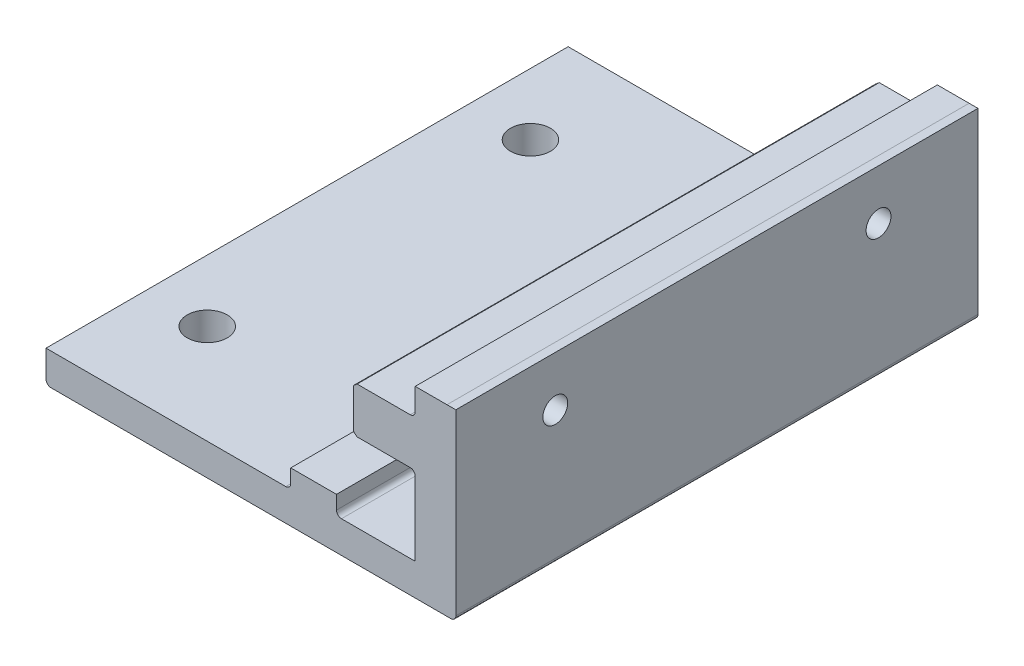
ISO-10303-21;
HEADER;
FILE_DESCRIPTION(('STEP AP214'),'2;1');
FILE_NAME('part.step','',(''),(''),'','','');
FILE_SCHEMA(('AUTOMOTIVE_DESIGN { 1 0 10303 214 1 1 1 1 }'));
ENDSEC;
DATA;
#1=APPLICATION_CONTEXT('core data for automotive mechanical design processes');
#2=APPLICATION_PROTOCOL_DEFINITION('international standard','automotive_design',2000,#1);
#3=PRODUCT_CONTEXT('',#1,'mechanical');
#4=PRODUCT('Part','Part','',(#3));
#5=PRODUCT_RELATED_PRODUCT_CATEGORY('part','',(#4));
#6=PRODUCT_DEFINITION_FORMATION('','',#4);
#7=PRODUCT_DEFINITION_CONTEXT('part definition',#1,'design');
#8=PRODUCT_DEFINITION('design','',#6,#7);
#9=PRODUCT_DEFINITION_SHAPE('','',#8);
#10=(LENGTH_UNIT() NAMED_UNIT(*) SI_UNIT(.MILLI.,.METRE.));
#11=(NAMED_UNIT(*) PLANE_ANGLE_UNIT() SI_UNIT($,.RADIAN.));
#12=(NAMED_UNIT(*) SI_UNIT($,.STERADIAN.) SOLID_ANGLE_UNIT());
#13=UNCERTAINTY_MEASURE_WITH_UNIT(LENGTH_MEASURE(1.E-05),#10,'distance_accuracy_value','');
#14=(GEOMETRIC_REPRESENTATION_CONTEXT(3) GLOBAL_UNCERTAINTY_ASSIGNED_CONTEXT((#13)) GLOBAL_UNIT_ASSIGNED_CONTEXT((#10,
#11,#12)) REPRESENTATION_CONTEXT('',''));
#15=CARTESIAN_POINT('',(0.,0.,0.));
#16=DIRECTION('',(0.,0.,1.));
#17=DIRECTION('',(1.,0.,0.));
#18=AXIS2_PLACEMENT_3D('',#15,#16,#17);
#19=CARTESIAN_POINT('',(17.7288391379452,22.9352063032006,-3749.675));
#20=DIRECTION('',(0.,-1.,0.));
#21=DIRECTION('',(0.,0.,-1.));
#22=AXIS2_PLACEMENT_3D('',#19,#20,#21);
#23=PLANE('',#22);
#24=DIRECTION('',(1.,0.,0.));
#25=VECTOR('',#24,1.);
#26=CARTESIAN_POINT('',(17.7288391379452,22.9352063032006,-3683.));
#27=LINE('',#26,#25);
#28=CARTESIAN_POINT('',(17.7288391379452,22.9352063032006,-3683.));
#29=VERTEX_POINT('',#28);
#30=CARTESIAN_POINT('',(21.7872141992322,22.9352063032006,-3683.));
#31=VERTEX_POINT('',#30);
#32=EDGE_CURVE('E274',#29,#31,#27,.T.);
#33=ORIENTED_EDGE('',*,*,#32,.T.);
#34=DIRECTION('',(0.,0.,1.));
#35=VECTOR('',#34,1.);
#36=CARTESIAN_POINT('',(21.7872141992322,22.9352063032006,-3749.675));
#37=LINE('',#36,#35);
#38=CARTESIAN_POINT('',(21.7872141992322,22.9352063032006,-3749.675));
#39=VERTEX_POINT('',#38);
#40=EDGE_CURVE('E362',#39,#31,#37,.T.);
#41=ORIENTED_EDGE('',*,*,#40,.F.);
#42=DIRECTION('',(1.,0.,0.));
#43=VECTOR('',#42,1.);
#44=CARTESIAN_POINT('',(17.7288391379452,22.9352063032006,-3749.675));
#45=LINE('',#44,#43);
#46=CARTESIAN_POINT('',(17.7288391379452,22.9352063032006,-3749.675));
#47=VERTEX_POINT('',#46);
#48=EDGE_CURVE('E319',#47,#39,#45,.T.);
#49=ORIENTED_EDGE('',*,*,#48,.F.);
#50=DIRECTION('',(0.,0.,1.));
#51=VECTOR('',#50,1.);
#52=CARTESIAN_POINT('',(17.7288391379452,22.9352063032006,-3749.675));
#53=LINE('',#52,#51);
#54=EDGE_CURVE('E273',#47,#29,#53,.T.);
#55=ORIENTED_EDGE('',*,*,#54,.T.);
#56=EDGE_LOOP('',(#33,#41,#49,#55));
#57=FACE_BOUND('',#56,.T.);
#58=ADVANCED_FACE('F33',(#57),#23,.F.);
#59=CARTESIAN_POINT('',(21.791921752024,-0.47513727151985,-3749.675));
#60=DIRECTION('',(-1.,0.,0.));
#61=DIRECTION('',(0.,0.,1.));
#62=AXIS2_PLACEMENT_3D('',#59,#60,#61);
#63=PLANE('',#62);
#64=DIRECTION('',(0.,-1.,0.));
#65=VECTOR('',#64,1.);
#66=CARTESIAN_POINT('',(21.791921752024,-0.47513727151985,-3683.));
#67=LINE('',#66,#65);
#68=CARTESIAN_POINT('',(21.791921752024,3.85912878792336,-3683.));
#69=VERTEX_POINT('',#68);
#70=CARTESIAN_POINT('',(21.791921752024,-0.47513727151985,-3683.));
#71=VERTEX_POINT('',#70);
#72=EDGE_CURVE('E277',#69,#71,#67,.T.);
#73=ORIENTED_EDGE('',*,*,#72,.T.);
#74=DIRECTION('',(0.,0.,1.));
#75=VECTOR('',#74,1.);
#76=CARTESIAN_POINT('',(21.791921752024,-0.47513727151985,-3749.675));
#77=LINE('',#76,#75);
#78=CARTESIAN_POINT('',(21.791921752024,-0.47513727151985,-3749.675));
#79=VERTEX_POINT('',#78);
#80=EDGE_CURVE('E356',#79,#71,#77,.T.);
#81=ORIENTED_EDGE('',*,*,#80,.F.);
#82=DIRECTION('',(0.,-1.,0.));
#83=VECTOR('',#82,1.);
#84=CARTESIAN_POINT('',(21.791921752024,3.58886272848015,-3749.675));
#85=LINE('',#84,#83);
#86=CARTESIAN_POINT('',(21.791921752024,3.85912878792336,-3749.675));
#87=VERTEX_POINT('',#86);
#88=EDGE_CURVE('E240',#87,#79,#85,.T.);
#89=ORIENTED_EDGE('',*,*,#88,.F.);
#90=DIRECTION('',(0.,0.,1.));
#91=VECTOR('',#90,1.);
#92=CARTESIAN_POINT('',(21.791921752024,3.85912878792336,-3749.675));
#93=LINE('',#92,#91);
#94=EDGE_CURVE('E359',#87,#69,#93,.T.);
#95=ORIENTED_EDGE('',*,*,#94,.T.);
#96=EDGE_LOOP('',(#73,#81,#89,#95));
#97=FACE_BOUND('',#96,.T.);
#98=ADVANCED_FACE('F456',(#97),#63,.F.);
#99=CARTESIAN_POINT('',(-8.21549203864979,-0.47513727151985,-3749.675));
#100=DIRECTION('',(0.,1.,0.));
#101=DIRECTION('',(-1.,0.,0.));
#102=AXIS2_PLACEMENT_3D('',#99,#100,#101);
#103=PLANE('',#102);
#104=CARTESIAN_POINT('',(4.75473410673884,-0.475137271519877,-3736.975));
#105=DIRECTION('',(0.,1.,0.));
#106=DIRECTION('',(0.,0.,1.));
#107=AXIS2_PLACEMENT_3D('',#104,#105,#106);
#108=CIRCLE('',#107,1.63195);
#109=CARTESIAN_POINT('',(4.75473410673884,-0.475137271519877,-3735.34305));
#110=VERTEX_POINT('',#109);
#111=EDGE_CURVE('E415',#110,#110,#108,.T.);
#112=ORIENTED_EDGE('',*,*,#111,.T.);
#113=EDGE_LOOP('',(#112));
#114=FACE_BOUND('',#113,.T.);
#115=CARTESIAN_POINT('',(4.75473410673883,-0.475137271519877,-3695.7));
#116=DIRECTION('',(0.,1.,0.));
#117=DIRECTION('',(0.,0.,1.));
#118=AXIS2_PLACEMENT_3D('',#115,#116,#117);
#119=CIRCLE('',#118,1.63195);
#120=CARTESIAN_POINT('',(4.75473410673883,-0.475137271519877,-3694.06805));
#121=VERTEX_POINT('',#120);
#122=EDGE_CURVE('E421',#121,#121,#119,.T.);
#123=ORIENTED_EDGE('',*,*,#122,.T.);
#124=EDGE_LOOP('',(#123));
#125=FACE_BOUND('',#124,.T.);
#126=CARTESIAN_POINT('',(-21.5301720386498,-0.475137271519847,-3736.975));
#127=DIRECTION('',(0.,1.,0.));
#128=DIRECTION('',(-1.,0.,0.));
#129=AXIS2_PLACEMENT_3D('',#126,#127,#128);
#130=CIRCLE('',#129,2.55269999999999);
#131=CARTESIAN_POINT('',(-24.0828720386498,-0.475137271519847,-3736.975));
#132=VERTEX_POINT('',#131);
#133=EDGE_CURVE('E437',#132,#132,#130,.T.);
#134=ORIENTED_EDGE('',*,*,#133,.T.);
#135=EDGE_LOOP('',(#134));
#136=FACE_BOUND('',#135,.T.);
#137=CARTESIAN_POINT('',(-21.5301720386498,-0.475137271519847,-3695.7));
#138=DIRECTION('',(0.,1.,0.));
#139=DIRECTION('',(-1.,0.,0.));
#140=AXIS2_PLACEMENT_3D('',#137,#138,#139);
#141=CIRCLE('',#140,2.55269999999999);
#142=CARTESIAN_POINT('',(-24.0828720386498,-0.475137271519847,-3695.7));
#143=VERTEX_POINT('',#142);
#144=EDGE_CURVE('E443',#143,#143,#141,.T.);
#145=ORIENTED_EDGE('',*,*,#144,.T.);
#146=EDGE_LOOP('',(#145));
#147=FACE_BOUND('',#146,.T.);
#148=DIRECTION('',(-1.,0.,0.));
#149=VECTOR('',#148,1.);
#150=CARTESIAN_POINT('',(-8.21549203864979,-0.47513727151985,-3683.));
#151=LINE('',#150,#149);
#152=CARTESIAN_POINT('',(-28.7818720386498,-0.475137271519846,-3683.));
#153=VERTEX_POINT('',#152);
#154=EDGE_CURVE('E281',#71,#153,#151,.T.);
#155=ORIENTED_EDGE('',*,*,#154,.T.);
#156=DIRECTION('',(0.,0.,1.));
#157=VECTOR('',#156,1.);
#158=CARTESIAN_POINT('',(-28.7818720386498,-0.475137271519846,-3749.675));
#159=LINE('',#158,#157);
#160=CARTESIAN_POINT('',(-28.7818720386498,-0.47513727151985,-3749.675));
#161=VERTEX_POINT('',#160);
#162=EDGE_CURVE('E374',#153,#161,#159,.F.);
#163=ORIENTED_EDGE('',*,*,#162,.T.);
#164=DIRECTION('',(-1.,0.,0.));
#165=VECTOR('',#164,1.);
#166=CARTESIAN_POINT('',(17.7279217520239,-0.47513727151985,-3749.675));
#167=LINE('',#166,#165);
#168=EDGE_CURVE('E236',#79,#161,#167,.T.);
#169=ORIENTED_EDGE('',*,*,#168,.F.);
#170=ORIENTED_EDGE('',*,*,#80,.T.);
#171=EDGE_LOOP('',(#155,#163,#169,#170));
#172=FACE_BOUND('',#171,.T.);
#173=ADVANCED_FACE('F459',(#114,#125,#136,#147,#172),#103,.F.);
#174=CARTESIAN_POINT('',(-7.94526589326117,3.58886272848015,-3749.675));
#175=DIRECTION('',(0.,-1.,0.));
#176=DIRECTION('',(1.,0.,0.));
#177=AXIS2_PLACEMENT_3D('',#174,#175,#176);
#178=PLANE('',#177);
#179=CARTESIAN_POINT('',(-21.5301720386498,3.58886272848015,-3736.975));
#180=DIRECTION('',(0.,1.,0.));
#181=DIRECTION('',(0.,0.,1.));
#182=AXIS2_PLACEMENT_3D('',#179,#180,#181);
#183=CIRCLE('',#182,2.55269999999999);
#184=CARTESIAN_POINT('',(-21.5301720386498,3.58886272848015,-3734.4223));
#185=VERTEX_POINT('',#184);
#186=EDGE_CURVE('E433',#185,#185,#183,.T.);
#187=ORIENTED_EDGE('',*,*,#186,.F.);
#188=EDGE_LOOP('',(#187));
#189=FACE_BOUND('',#188,.T.);
#190=CARTESIAN_POINT('',(-21.5301720386498,3.58886272848015,-3695.7));
#191=DIRECTION('',(0.,1.,0.));
#192=DIRECTION('',(0.,0.,1.));
#193=AXIS2_PLACEMENT_3D('',#190,#191,#192);
#194=CIRCLE('',#193,2.55269999999999);
#195=CARTESIAN_POINT('',(-21.5301720386498,3.58886272848015,-3693.1473));
#196=VERTEX_POINT('',#195);
#197=EDGE_CURVE('E440',#196,#196,#194,.T.);
#198=ORIENTED_EDGE('',*,*,#197,.F.);
#199=EDGE_LOOP('',(#198));
#200=FACE_BOUND('',#199,.T.);
#201=DIRECTION('',(1.,0.,0.));
#202=VECTOR('',#201,1.);
#203=CARTESIAN_POINT('',(-8.21549203864979,3.58886272848015,-3749.675));
#204=LINE('',#203,#202);
#205=CARTESIAN_POINT('',(-29.4168720386498,3.58886272848015,-3749.675));
#206=VERTEX_POINT('',#205);
#207=CARTESIAN_POINT('',(1.19873410673898,3.58886272848015,-3749.675));
#208=VERTEX_POINT('',#207);
#209=EDGE_CURVE('E214',#206,#208,#204,.T.);
#210=ORIENTED_EDGE('',*,*,#209,.F.);
#211=DIRECTION('',(0.,0.,1.));
#212=VECTOR('',#211,1.);
#213=CARTESIAN_POINT('',(-29.4168720386498,3.58886272848015,-3749.675));
#214=LINE('',#213,#212);
#215=CARTESIAN_POINT('',(-29.4168720386498,3.58886272848015,-3683.));
#216=VERTEX_POINT('',#215);
#217=EDGE_CURVE('E221',#206,#216,#214,.T.);
#218=ORIENTED_EDGE('',*,*,#217,.T.);
#219=DIRECTION('',(1.,0.,0.));
#220=VECTOR('',#219,1.);
#221=CARTESIAN_POINT('',(-7.94526589326117,3.58886272848015,-3683.));
#222=LINE('',#221,#220);
#223=CARTESIAN_POINT('',(1.19873410673898,3.58886272848015,-3683.));
#224=VERTEX_POINT('',#223);
#225=EDGE_CURVE('E284',#216,#224,#222,.T.);
#226=ORIENTED_EDGE('',*,*,#225,.T.);
#227=DIRECTION('',(0.,0.,1.));
#228=VECTOR('',#227,1.);
#229=CARTESIAN_POINT('',(1.19873410673898,3.58886272848015,-3749.675));
#230=LINE('',#229,#228);
#231=EDGE_CURVE('E233',#208,#224,#230,.T.);
#232=ORIENTED_EDGE('',*,*,#231,.F.);
#233=EDGE_LOOP('',(#210,#218,#226,#232));
#234=FACE_BOUND('',#233,.T.);
#235=ADVANCED_FACE('F231',(#189,#200,#234),#178,.F.);
#236=CARTESIAN_POINT('',(1.19873410673898,4.22386272848,-3749.675));
#237=DIRECTION('',(0.,0.,1.));
#238=DIRECTION('',(1.,0.,0.));
#239=AXIS2_PLACEMENT_3D('',#236,#237,#238);
#240=CYLINDRICAL_SURFACE('',#239,0.634999999999852);
#241=CARTESIAN_POINT('',(1.19873410673898,4.22386272848,-3683.));
#242=DIRECTION('',(0.,0.,1.));
#243=DIRECTION('',(1.,0.,0.));
#244=AXIS2_PLACEMENT_3D('',#241,#242,#243);
#245=CIRCLE('',#244,0.634999999999852);
#246=CARTESIAN_POINT('',(1.83373410673883,4.22386272848,-3683.));
#247=VERTEX_POINT('',#246);
#248=EDGE_CURVE('E286',#224,#247,#245,.T.);
#249=ORIENTED_EDGE('',*,*,#248,.T.);
#250=DIRECTION('',(0.,0.,1.));
#251=VECTOR('',#250,1.);
#252=CARTESIAN_POINT('',(1.83373410673883,4.22386272848,-3749.675));
#253=LINE('',#252,#251);
#254=CARTESIAN_POINT('',(1.83373410673883,4.22386272848,-3749.675));
#255=VERTEX_POINT('',#254);
#256=EDGE_CURVE('E352',#255,#247,#253,.T.);
#257=ORIENTED_EDGE('',*,*,#256,.F.);
#258=CARTESIAN_POINT('',(1.19873410673898,4.22386272848,-3749.675));
#259=DIRECTION('',(0.,0.,1.));
#260=DIRECTION('',(1.,0.,0.));
#261=AXIS2_PLACEMENT_3D('',#258,#259,#260);
#262=CIRCLE('',#261,0.634999999999852);
#263=EDGE_CURVE('E235',#208,#255,#262,.T.);
#264=ORIENTED_EDGE('',*,*,#263,.F.);
#265=ORIENTED_EDGE('',*,*,#231,.T.);
#266=EDGE_LOOP('',(#249,#257,#264,#265));
#267=FACE_BOUND('',#266,.T.);
#268=ADVANCED_FACE('F533',(#267),#240,.F.);
#269=CARTESIAN_POINT('',(1.83373410673883,4.22386272848,-3749.675));
#270=DIRECTION('',(1.,0.,0.));
#271=DIRECTION('',(0.,0.,-1.));
#272=AXIS2_PLACEMENT_3D('',#269,#270,#271);
#273=PLANE('',#272);
#274=DIRECTION('',(0.,1.,0.));
#275=VECTOR('',#274,1.);
#276=CARTESIAN_POINT('',(1.83373410673883,4.22386272848,-3683.));
#277=LINE('',#276,#275);
#278=CARTESIAN_POINT('',(1.83373410673883,5.97011272848015,-3683.));
#279=VERTEX_POINT('',#278);
#280=EDGE_CURVE('E288',#247,#279,#277,.T.);
#281=ORIENTED_EDGE('',*,*,#280,.T.);
#282=DIRECTION('',(0.,0.,-1.));
#283=VECTOR('',#282,1.);
#284=CARTESIAN_POINT('',(1.83373410673883,5.97011272848015,-3683.));
#285=LINE('',#284,#283);
#286=CARTESIAN_POINT('',(1.83373410673883,5.97011272848015,-3749.675));
#287=VERTEX_POINT('',#286);
#288=EDGE_CURVE('E430',#279,#287,#285,.T.);
#289=ORIENTED_EDGE('',*,*,#288,.T.);
#290=DIRECTION('',(0.,1.,0.));
#291=VECTOR('',#290,1.);
#292=CARTESIAN_POINT('',(1.83373410673883,4.22386272848,-3749.675));
#293=LINE('',#292,#291);
#294=EDGE_CURVE('E238',#255,#287,#293,.T.);
#295=ORIENTED_EDGE('',*,*,#294,.F.);
#296=ORIENTED_EDGE('',*,*,#256,.T.);
#297=EDGE_LOOP('',(#281,#289,#295,#296));
#298=FACE_BOUND('',#297,.T.);
#299=ADVANCED_FACE('F735',(#298),#273,.F.);
#300=CARTESIAN_POINT('',(7.67573410673884,5.7478627284803,-3749.675));
#301=DIRECTION('',(-1.,0.,0.));
#302=DIRECTION('',(0.,0.,1.));
#303=AXIS2_PLACEMENT_3D('',#300,#301,#302);
#304=PLANE('',#303);
#305=DIRECTION('',(0.,-1.,0.));
#306=VECTOR('',#305,1.);
#307=CARTESIAN_POINT('',(7.67573410673884,5.7478627284803,-3749.675));
#308=LINE('',#307,#306);
#309=CARTESIAN_POINT('',(7.67573410673884,5.97011272848015,-3749.675));
#310=VERTEX_POINT('',#309);
#311=CARTESIAN_POINT('',(7.67573410673884,4.22386272848,-3749.675));
#312=VERTEX_POINT('',#311);
#313=EDGE_CURVE('E246',#310,#312,#308,.T.);
#314=ORIENTED_EDGE('',*,*,#313,.F.);
#315=DIRECTION('',(0.,0.,-1.));
#316=VECTOR('',#315,1.);
#317=CARTESIAN_POINT('',(7.67573410673884,5.97011272848015,-3683.));
#318=LINE('',#317,#316);
#319=CARTESIAN_POINT('',(7.67573410673884,5.97011272848015,-3683.));
#320=VERTEX_POINT('',#319);
#321=EDGE_CURVE('E428',#320,#310,#318,.T.);
#322=ORIENTED_EDGE('',*,*,#321,.F.);
#323=DIRECTION('',(0.,-1.,0.));
#324=VECTOR('',#323,1.);
#325=CARTESIAN_POINT('',(7.67573410673884,5.7478627284803,-3683.));
#326=LINE('',#325,#324);
#327=CARTESIAN_POINT('',(7.67573410673884,4.22386272848,-3683.));
#328=VERTEX_POINT('',#327);
#329=EDGE_CURVE('E291',#320,#328,#326,.T.);
#330=ORIENTED_EDGE('',*,*,#329,.T.);
#331=DIRECTION('',(0.,0.,1.));
#332=VECTOR('',#331,1.);
#333=CARTESIAN_POINT('',(7.67573410673884,4.22386272848,-3749.675));
#334=LINE('',#333,#332);
#335=EDGE_CURVE('E349',#312,#328,#334,.T.);
#336=ORIENTED_EDGE('',*,*,#335,.F.);
#337=EDGE_LOOP('',(#314,#322,#330,#336));
#338=FACE_BOUND('',#337,.T.);
#339=ADVANCED_FACE('F725',(#338),#304,.F.);
#340=CARTESIAN_POINT('',(8.31073410673869,4.22386272848,-3749.675));
#341=DIRECTION('',(0.,0.,1.));
#342=DIRECTION('',(1.,0.,0.));
#343=AXIS2_PLACEMENT_3D('',#340,#341,#342);
#344=CYLINDRICAL_SURFACE('',#343,0.634999999999847);
#345=CARTESIAN_POINT('',(8.31073410673869,4.22386272848,-3683.));
#346=DIRECTION('',(0.,0.,1.));
#347=DIRECTION('',(1.,0.,0.));
#348=AXIS2_PLACEMENT_3D('',#345,#346,#347);
#349=CIRCLE('',#348,0.634999999999847);
#350=CARTESIAN_POINT('',(8.31073410673869,3.58886272848015,-3683.));
#351=VERTEX_POINT('',#350);
#352=EDGE_CURVE('E293',#328,#351,#349,.T.);
#353=ORIENTED_EDGE('',*,*,#352,.T.);
#354=DIRECTION('',(0.,0.,1.));
#355=VECTOR('',#354,1.);
#356=CARTESIAN_POINT('',(8.31073410673869,3.58886272848015,-3749.675));
#357=LINE('',#356,#355);
#358=CARTESIAN_POINT('',(8.31073410673869,3.58886272848015,-3749.675));
#359=VERTEX_POINT('',#358);
#360=EDGE_CURVE('E346',#359,#351,#357,.T.);
#361=ORIENTED_EDGE('',*,*,#360,.F.);
#362=CARTESIAN_POINT('',(8.31073410673869,4.22386272848,-3749.675));
#363=DIRECTION('',(0.,0.,1.));
#364=DIRECTION('',(1.,0.,0.));
#365=AXIS2_PLACEMENT_3D('',#362,#363,#364);
#366=CIRCLE('',#365,0.634999999999847);
#367=EDGE_CURVE('E248',#312,#359,#366,.T.);
#368=ORIENTED_EDGE('',*,*,#367,.F.);
#369=ORIENTED_EDGE('',*,*,#335,.T.);
#370=EDGE_LOOP('',(#353,#361,#368,#369));
#371=FACE_BOUND('',#370,.T.);
#372=ADVANCED_FACE('F713',(#371),#344,.F.);
#373=CARTESIAN_POINT('',(17.4547341067388,3.58886272848015,-3749.675));
#374=DIRECTION('',(0.,-1.,0.));
#375=DIRECTION('',(1.,0.,0.));
#376=AXIS2_PLACEMENT_3D('',#373,#374,#375);
#377=PLANE('',#376);
#378=DIRECTION('',(1.,0.,0.));
#379=VECTOR('',#378,1.);
#380=CARTESIAN_POINT('',(17.4547341067388,3.58886272848015,-3683.));
#381=LINE('',#380,#379);
#382=CARTESIAN_POINT('',(17.7279217520239,3.58886272848015,-3683.));
#383=VERTEX_POINT('',#382);
#384=EDGE_CURVE('E296',#351,#383,#381,.T.);
#385=ORIENTED_EDGE('',*,*,#384,.T.);
#386=DIRECTION('',(0.,0.,1.));
#387=VECTOR('',#386,1.);
#388=CARTESIAN_POINT('',(17.7279217520239,3.58886272848015,-3749.675));
#389=LINE('',#388,#387);
#390=CARTESIAN_POINT('',(17.7279217520239,3.58886272848015,-3749.675));
#391=VERTEX_POINT('',#390);
#392=EDGE_CURVE('E343',#391,#383,#389,.T.);
#393=ORIENTED_EDGE('',*,*,#392,.F.);
#394=DIRECTION('',(1.,0.,0.));
#395=VECTOR('',#394,1.);
#396=CARTESIAN_POINT('',(8.31073410673869,3.58886272848015,-3749.675));
#397=LINE('',#396,#395);
#398=EDGE_CURVE('E250',#359,#391,#397,.T.);
#399=ORIENTED_EDGE('',*,*,#398,.F.);
#400=ORIENTED_EDGE('',*,*,#360,.T.);
#401=EDGE_LOOP('',(#385,#393,#399,#400));
#402=FACE_BOUND('',#401,.T.);
#403=ADVANCED_FACE('F704',(#402),#377,.F.);
#404=CARTESIAN_POINT('',(17.7279217520239,3.58886272848015,-3749.675));
#405=DIRECTION('',(1.,0.,0.));
#406=DIRECTION('',(0.,0.,-1.));
#407=AXIS2_PLACEMENT_3D('',#404,#405,#406);
#408=PLANE('',#407);
#409=DIRECTION('',(0.,1.,0.));
#410=VECTOR('',#409,1.);
#411=CARTESIAN_POINT('',(17.7279217520239,3.58886272848015,-3683.));
#412=LINE('',#411,#410);
#413=CARTESIAN_POINT('',(17.7279217520239,3.85884275420049,-3683.));
#414=VERTEX_POINT('',#413);
#415=EDGE_CURVE('E298',#383,#414,#412,.T.);
#416=ORIENTED_EDGE('',*,*,#415,.T.);
#417=DIRECTION('',(0.,0.,1.));
#418=VECTOR('',#417,1.);
#419=CARTESIAN_POINT('',(17.7279217520239,3.85884275420049,-3749.675));
#420=LINE('',#419,#418);
#421=CARTESIAN_POINT('',(17.7279217520239,3.85884275420049,-3749.675));
#422=VERTEX_POINT('',#421);
#423=EDGE_CURVE('E340',#422,#414,#420,.T.);
#424=ORIENTED_EDGE('',*,*,#423,.F.);
#425=DIRECTION('',(0.,1.,0.));
#426=VECTOR('',#425,1.);
#427=CARTESIAN_POINT('',(17.7279217520239,3.58886272848015,-3749.675));
#428=LINE('',#427,#426);
#429=EDGE_CURVE('E252',#391,#422,#428,.T.);
#430=ORIENTED_EDGE('',*,*,#429,.F.);
#431=ORIENTED_EDGE('',*,*,#392,.T.);
#432=EDGE_LOOP('',(#416,#424,#430,#431));
#433=FACE_BOUND('',#432,.T.);
#434=ADVANCED_FACE('F695',(#433),#408,.F.);
#435=CARTESIAN_POINT('',(17.7279217520239,3.85884275420049,-3749.675));
#436=DIRECTION('',(0.999999998843667,-4.80901885618899E-05,0.));
#437=DIRECTION('',(4.80901885618899E-05,0.999999998843667,0.));
#438=AXIS2_PLACEMENT_3D('',#435,#436,#437);
#439=PLANE('',#438);
#440=DIRECTION('',(4.80901885618899E-05,0.999999998843667,0.));
#441=VECTOR('',#440,1.);
#442=CARTESIAN_POINT('',(17.7279217520239,3.85884275420049,-3683.));
#443=LINE('',#442,#441);
#444=CARTESIAN_POINT('',(17.7283614660931,13.002372480981,-3683.));
#445=VERTEX_POINT('',#444);
#446=EDGE_CURVE('E300',#414,#445,#443,.T.);
#447=ORIENTED_EDGE('',*,*,#446,.T.);
#448=DIRECTION('',(0.,0.,1.));
#449=VECTOR('',#448,1.);
#450=CARTESIAN_POINT('',(17.7283614660931,13.002372480981,-3749.675));
#451=LINE('',#450,#449);
#452=CARTESIAN_POINT('',(17.7283614660931,13.002372480981,-3749.675));
#453=VERTEX_POINT('',#452);
#454=EDGE_CURVE('E337',#453,#445,#451,.T.);
#455=ORIENTED_EDGE('',*,*,#454,.F.);
#456=DIRECTION('',(4.80901885618899E-05,0.999999998843667,0.));
#457=VECTOR('',#456,1.);
#458=CARTESIAN_POINT('',(17.7279217520239,3.85884275420049,-3749.675));
#459=LINE('',#458,#457);
#460=EDGE_CURVE('E254',#422,#453,#459,.T.);
#461=ORIENTED_EDGE('',*,*,#460,.F.);
#462=ORIENTED_EDGE('',*,*,#423,.T.);
#463=EDGE_LOOP('',(#447,#455,#461,#462));
#464=FACE_BOUND('',#463,.T.);
#465=ADVANCED_FACE('F686',(#464),#439,.F.);
#466=CARTESIAN_POINT('',(17.0929217520241,13.0024030393967,-3749.675));
#467=DIRECTION('',(0.,0.,1.));
#468=DIRECTION('',(1.,0.,0.));
#469=AXIS2_PLACEMENT_3D('',#466,#467,#468);
#470=CYLINDRICAL_SURFACE('',#469,0.635439714803768);
#471=CARTESIAN_POINT('',(17.0929217520241,13.0024030393967,-3683.));
#472=DIRECTION('',(0.,0.,1.));
#473=DIRECTION('',(1.,0.,0.));
#474=AXIS2_PLACEMENT_3D('',#471,#472,#473);
#475=CIRCLE('',#474,0.635439714803768);
#476=CARTESIAN_POINT('',(17.0929217520241,13.6378427542005,-3683.));
#477=VERTEX_POINT('',#476);
#478=EDGE_CURVE('E302',#445,#477,#475,.T.);
#479=ORIENTED_EDGE('',*,*,#478,.T.);
#480=DIRECTION('',(0.,0.,1.));
#481=VECTOR('',#480,1.);
#482=CARTESIAN_POINT('',(17.0929217520241,13.6378427542005,-3749.675));
#483=LINE('',#482,#481);
#484=CARTESIAN_POINT('',(17.0929217520241,13.6378427542005,-3749.675));
#485=VERTEX_POINT('',#484);
#486=EDGE_CURVE('E334',#485,#477,#483,.T.);
#487=ORIENTED_EDGE('',*,*,#486,.F.);
#488=CARTESIAN_POINT('',(17.0929217520241,13.0024030393967,-3749.675));
#489=DIRECTION('',(0.,0.,1.));
#490=DIRECTION('',(1.,0.,0.));
#491=AXIS2_PLACEMENT_3D('',#488,#489,#490);
#492=CIRCLE('',#491,0.635439714803768);
#493=EDGE_CURVE('E256',#453,#485,#492,.T.);
#494=ORIENTED_EDGE('',*,*,#493,.F.);
#495=ORIENTED_EDGE('',*,*,#454,.T.);
#496=EDGE_LOOP('',(#479,#487,#494,#495));
#497=FACE_BOUND('',#496,.T.);
#498=ADVANCED_FACE('F666',(#497),#470,.F.);
#499=CARTESIAN_POINT('',(17.0929217520241,13.6378427542005,-3749.675));
#500=DIRECTION('',(0.,1.,0.));
#501=DIRECTION('',(-1.,0.,0.));
#502=AXIS2_PLACEMENT_3D('',#499,#500,#501);
#503=PLANE('',#502);
#504=DIRECTION('',(-1.,0.,0.));
#505=VECTOR('',#504,1.);
#506=CARTESIAN_POINT('',(17.0929217520241,13.6378427542005,-3683.));
#507=LINE('',#506,#505);
#508=CARTESIAN_POINT('',(10.3079798708025,13.6378427542006,-3683.));
#509=VERTEX_POINT('',#508);
#510=EDGE_CURVE('E304',#477,#509,#507,.T.);
#511=ORIENTED_EDGE('',*,*,#510,.T.);
#512=DIRECTION('',(0.,0.,1.));
#513=VECTOR('',#512,1.);
#514=CARTESIAN_POINT('',(10.3079798708025,13.6378427542006,-3749.676));
#515=LINE('',#514,#513);
#516=CARTESIAN_POINT('',(10.3079798708025,13.6378427542006,-3749.675));
#517=VERTEX_POINT('',#516);
#518=EDGE_CURVE('E446',#517,#509,#515,.T.);
#519=ORIENTED_EDGE('',*,*,#518,.F.);
#520=DIRECTION('',(-1.,0.,0.));
#521=VECTOR('',#520,1.);
#522=CARTESIAN_POINT('',(17.0929217520241,13.6378427542005,-3749.675));
#523=LINE('',#522,#521);
#524=EDGE_CURVE('E258',#485,#517,#523,.T.);
#525=ORIENTED_EDGE('',*,*,#524,.F.);
#526=ORIENTED_EDGE('',*,*,#486,.T.);
#527=EDGE_LOOP('',(#511,#519,#525,#526));
#528=FACE_BOUND('',#527,.T.);
#529=ADVANCED_FACE('F663',(#528),#503,.F.);
#530=CARTESIAN_POINT('',(14.4259217940422,10.1824792052005,-3749.675));
#531=DIRECTION('',(0.642787609686549,0.76604444311897,0.));
#532=DIRECTION('',(-0.76604444311897,0.642787609686549,0.));
#533=AXIS2_PLACEMENT_3D('',#530,#531,#532);
#534=PLANE('',#533);
#535=DIRECTION('',(-0.76604444311897,0.642787609686549,0.));
#536=VECTOR('',#535,1.);
#537=CARTESIAN_POINT('',(14.4259217940422,10.1824792052005,-3749.675));
#538=LINE('',#537,#536);
#539=CARTESIAN_POINT('',(9.85392175202405,14.0188427542006,-3749.675));
#540=VERTEX_POINT('',#539);
#541=EDGE_CURVE('E260',#517,#540,#538,.T.);
#542=ORIENTED_EDGE('',*,*,#541,.F.);
#543=ORIENTED_EDGE('',*,*,#518,.T.);
#544=DIRECTION('',(-0.76604444311897,0.642787609686549,0.));
#545=VECTOR('',#544,1.);
#546=CARTESIAN_POINT('',(14.4259217940422,10.1824792052005,-3683.));
#547=LINE('',#546,#545);
#548=CARTESIAN_POINT('',(9.85392175202405,14.0188427542006,-3683.));
#549=VERTEX_POINT('',#548);
#550=EDGE_CURVE('E306',#509,#549,#547,.T.);
#551=ORIENTED_EDGE('',*,*,#550,.T.);
#552=DIRECTION('',(0.,0.,1.));
#553=VECTOR('',#552,1.);
#554=CARTESIAN_POINT('',(9.85392175202405,14.0188427542006,-3749.675));
#555=LINE('',#554,#553);
#556=EDGE_CURVE('E331',#540,#549,#555,.T.);
#557=ORIENTED_EDGE('',*,*,#556,.F.);
#558=EDGE_LOOP('',(#542,#543,#551,#557));
#559=FACE_BOUND('',#558,.T.);
#560=ADVANCED_FACE('F618',(#559),#534,.F.);
#561=CARTESIAN_POINT('',(9.85392175202405,14.0188427542006,-3749.675));
#562=DIRECTION('',(1.,0.,0.));
#563=DIRECTION('',(0.,0.,-1.));
#564=AXIS2_PLACEMENT_3D('',#561,#562,#563);
#565=PLANE('',#564);
#566=CARTESIAN_POINT('',(9.85392175202405,16.5588427542006,-3736.975));
#567=DIRECTION('',(-1.,0.,0.));
#568=DIRECTION('',(0.,0.,1.));
#569=AXIS2_PLACEMENT_3D('',#566,#567,#568);
#570=CIRCLE('',#569,1.5875);
#571=CARTESIAN_POINT('',(9.85392175202405,16.5588427542006,-3735.3875));
#572=VERTEX_POINT('',#571);
#573=EDGE_CURVE('E229',#572,#572,#570,.T.);
#574=ORIENTED_EDGE('',*,*,#573,.F.);
#575=EDGE_LOOP('',(#574));
#576=FACE_BOUND('',#575,.T.);
#577=CARTESIAN_POINT('',(9.85392175202405,16.5588427542006,-3695.7));
#578=DIRECTION('',(-1.,0.,0.));
#579=DIRECTION('',(0.,0.,1.));
#580=AXIS2_PLACEMENT_3D('',#577,#578,#579);
#581=CIRCLE('',#580,1.5875);
#582=CARTESIAN_POINT('',(9.85392175202405,16.5588427542006,-3694.1125));
#583=VERTEX_POINT('',#582);
#584=EDGE_CURVE('E368',#583,#583,#581,.T.);
#585=ORIENTED_EDGE('',*,*,#584,.F.);
#586=EDGE_LOOP('',(#585));
#587=FACE_BOUND('',#586,.T.);
#588=DIRECTION('',(0.,1.,0.));
#589=VECTOR('',#588,1.);
#590=CARTESIAN_POINT('',(9.85392175202405,14.0188427542006,-3683.));
#591=LINE('',#590,#589);
#592=CARTESIAN_POINT('',(9.85392175202405,19.0988427542006,-3683.));
#593=VERTEX_POINT('',#592);
#594=EDGE_CURVE('E308',#549,#593,#591,.T.);
#595=ORIENTED_EDGE('',*,*,#594,.T.);
#596=DIRECTION('',(0.,0.,1.));
#597=VECTOR('',#596,1.);
#598=CARTESIAN_POINT('',(9.85392175202405,19.0988427542006,-3749.675));
#599=LINE('',#598,#597);
#600=CARTESIAN_POINT('',(9.85392175202405,19.0988427542006,-3749.675));
#601=VERTEX_POINT('',#600);
#602=EDGE_CURVE('E328',#601,#593,#599,.T.);
#603=ORIENTED_EDGE('',*,*,#602,.F.);
#604=DIRECTION('',(0.,1.,0.));
#605=VECTOR('',#604,1.);
#606=CARTESIAN_POINT('',(9.85392175202405,14.0188427542006,-3749.675));
#607=LINE('',#606,#605);
#608=EDGE_CURVE('E262',#540,#601,#607,.T.);
#609=ORIENTED_EDGE('',*,*,#608,.F.);
#610=ORIENTED_EDGE('',*,*,#556,.T.);
#611=EDGE_LOOP('',(#595,#603,#609,#610));
#612=FACE_BOUND('',#611,.T.);
#613=ADVANCED_FACE('F613',(#576,#587,#612),#565,.F.);
#614=CARTESIAN_POINT('',(9.85392175202405,19.0988427542006,-3749.675));
#615=DIRECTION('',(0.642787609686534,-0.766044443118982,0.));
#616=DIRECTION('',(0.766044443118983,0.642787609686534,0.));
#617=AXIS2_PLACEMENT_3D('',#614,#615,#616);
#618=PLANE('',#617);
#619=DIRECTION('',(0.766044443118983,0.642787609686534,0.));
#620=VECTOR('',#619,1.);
#621=CARTESIAN_POINT('',(9.85392175202405,19.0988427542006,-3683.));
#622=LINE('',#621,#620);
#623=CARTESIAN_POINT('',(10.3079798708025,19.4798427542007,-3683.));
#624=VERTEX_POINT('',#623);
#625=EDGE_CURVE('E310',#593,#624,#622,.T.);
#626=ORIENTED_EDGE('',*,*,#625,.T.);
#627=DIRECTION('',(0.,0.,1.));
#628=VECTOR('',#627,1.);
#629=CARTESIAN_POINT('',(10.3079798708025,19.4798427542007,-3749.676));
#630=LINE('',#629,#628);
#631=CARTESIAN_POINT('',(10.3079798708025,19.4798427542007,-3749.675));
#632=VERTEX_POINT('',#631);
#633=EDGE_CURVE('E278',#632,#624,#630,.T.);
#634=ORIENTED_EDGE('',*,*,#633,.F.);
#635=DIRECTION('',(0.766044443118983,0.642787609686534,0.));
#636=VECTOR('',#635,1.);
#637=CARTESIAN_POINT('',(9.85392175202405,19.0988427542006,-3749.675));
#638=LINE('',#637,#636);
#639=EDGE_CURVE('E264',#601,#632,#638,.T.);
#640=ORIENTED_EDGE('',*,*,#639,.F.);
#641=ORIENTED_EDGE('',*,*,#602,.T.);
#642=EDGE_LOOP('',(#626,#634,#640,#641));
#643=FACE_BOUND('',#642,.T.);
#644=ADVANCED_FACE('F617',(#643),#618,.F.);
#645=CARTESIAN_POINT('',(15.568921752024,19.4798427542007,-3749.675));
#646=DIRECTION('',(0.,-1.,0.));
#647=DIRECTION('',(0.,0.,-1.));
#648=AXIS2_PLACEMENT_3D('',#645,#646,#647);
#649=PLANE('',#648);
#650=DIRECTION('',(1.,0.,0.));
#651=VECTOR('',#650,1.);
#652=CARTESIAN_POINT('',(15.568921752024,19.4798427542007,-3683.));
#653=LINE('',#652,#651);
#654=CARTESIAN_POINT('',(17.0929217520242,19.4798427542007,-3683.));
#655=VERTEX_POINT('',#654);
#656=EDGE_CURVE('E313',#624,#655,#653,.T.);
#657=ORIENTED_EDGE('',*,*,#656,.T.);
#658=DIRECTION('',(0.,0.,1.));
#659=VECTOR('',#658,1.);
#660=CARTESIAN_POINT('',(17.0929217520242,19.4798427542007,-3749.675));
#661=LINE('',#660,#659);
#662=CARTESIAN_POINT('',(17.0929217520242,19.4798427542007,-3749.675));
#663=VERTEX_POINT('',#662);
#664=EDGE_CURVE('E325',#663,#655,#661,.T.);
#665=ORIENTED_EDGE('',*,*,#664,.F.);
#666=DIRECTION('',(1.,0.,0.));
#667=VECTOR('',#666,1.);
#668=CARTESIAN_POINT('',(15.568921752024,19.4798427542007,-3749.675));
#669=LINE('',#668,#667);
#670=EDGE_CURVE('E267',#632,#663,#669,.T.);
#671=ORIENTED_EDGE('',*,*,#670,.F.);
#672=ORIENTED_EDGE('',*,*,#633,.T.);
#673=EDGE_LOOP('',(#657,#665,#671,#672));
#674=FACE_BOUND('',#673,.T.);
#675=ADVANCED_FACE('F634',(#674),#649,.F.);
#676=CARTESIAN_POINT('',(17.0929217520242,20.1156245451678,-3749.675));
#677=DIRECTION('',(0.,0.,1.));
#678=DIRECTION('',(1.,0.,0.));
#679=AXIS2_PLACEMENT_3D('',#676,#677,#678);
#680=CYLINDRICAL_SURFACE('',#679,0.635781790967193);
#681=CARTESIAN_POINT('',(17.0929217520242,20.1156245451678,-3683.));
#682=DIRECTION('',(0.,0.,1.));
#683=DIRECTION('',(1.,0.,0.));
#684=AXIS2_PLACEMENT_3D('',#681,#682,#683);
#685=CIRCLE('',#684,0.635781790967193);
#686=CARTESIAN_POINT('',(17.7287035422562,20.1155939703016,-3683.));
#687=VERTEX_POINT('',#686);
#688=EDGE_CURVE('E315',#655,#687,#685,.T.);
#689=ORIENTED_EDGE('',*,*,#688,.T.);
#690=DIRECTION('',(0.,0.,1.));
#691=VECTOR('',#690,1.);
#692=CARTESIAN_POINT('',(17.7287035422562,20.1155939703016,-3749.675));
#693=LINE('',#692,#691);
#694=CARTESIAN_POINT('',(17.7287035422562,20.1155939703016,-3749.675));
#695=VERTEX_POINT('',#694);
#696=EDGE_CURVE('E322',#695,#687,#693,.T.);
#697=ORIENTED_EDGE('',*,*,#696,.F.);
#698=CARTESIAN_POINT('',(17.0929217520242,20.1156245451678,-3749.675));
#699=DIRECTION('',(0.,0.,1.));
#700=DIRECTION('',(1.,0.,0.));
#701=AXIS2_PLACEMENT_3D('',#698,#699,#700);
#702=CIRCLE('',#701,0.635781790967193);
#703=EDGE_CURVE('E269',#663,#695,#702,.T.);
#704=ORIENTED_EDGE('',*,*,#703,.F.);
#705=ORIENTED_EDGE('',*,*,#664,.T.);
#706=EDGE_LOOP('',(#689,#697,#704,#705));
#707=FACE_BOUND('',#706,.T.);
#708=ADVANCED_FACE('F641',(#707),#680,.F.);
#709=CARTESIAN_POINT('',(17.7287035422562,20.1155939703016,-3749.675));
#710=DIRECTION('',(0.999999998843667,-4.80901885604205E-05,0.));
#711=DIRECTION('',(4.80901885604206E-05,0.999999998843667,0.));
#712=AXIS2_PLACEMENT_3D('',#709,#710,#711);
#713=PLANE('',#712);
#714=DIRECTION('',(4.80901885604206E-05,0.999999998843667,0.));
#715=VECTOR('',#714,1.);
#716=CARTESIAN_POINT('',(17.7287035422562,20.1155939703016,-3683.));
#717=LINE('',#716,#715);
#718=EDGE_CURVE('E317',#687,#29,#717,.T.);
#719=ORIENTED_EDGE('',*,*,#718,.T.);
#720=ORIENTED_EDGE('',*,*,#54,.F.);
#721=DIRECTION('',(4.80901885604206E-05,0.999999998843667,0.));
#722=VECTOR('',#721,1.);
#723=CARTESIAN_POINT('',(17.7287035422562,20.1155939703016,-3749.675));
#724=LINE('',#723,#722);
#725=EDGE_CURVE('E271',#695,#47,#724,.T.);
#726=ORIENTED_EDGE('',*,*,#725,.F.);
#727=ORIENTED_EDGE('',*,*,#696,.T.);
#728=EDGE_LOOP('',(#719,#720,#726,#727));
#729=FACE_BOUND('',#728,.T.);
#730=ADVANCED_FACE('F556',(#729),#713,.F.);
#731=CARTESIAN_POINT('',(1.19873410673898,4.22386272848,-3749.675));
#732=DIRECTION('',(0.,0.,1.));
#733=DIRECTION('',(1.,0.,0.));
#734=AXIS2_PLACEMENT_3D('',#731,#732,#733);
#735=PLANE('',#734);
#736=ORIENTED_EDGE('',*,*,#168,.T.);
#737=CARTESIAN_POINT('',(-28.7818720386498,0.159862728480154,-3749.675));
#738=DIRECTION('',(0.,0.,1.));
#739=DIRECTION('',(1.,0.,0.));
#740=AXIS2_PLACEMENT_3D('',#737,#738,#739);
#741=CIRCLE('',#740,0.635);
#742=CARTESIAN_POINT('',(-29.4168720386498,0.159862728480154,-3749.675));
#743=VERTEX_POINT('',#742);
#744=EDGE_CURVE('E217',#161,#743,#741,.F.);
#745=ORIENTED_EDGE('',*,*,#744,.T.);
#746=DIRECTION('',(0.,1.,0.));
#747=VECTOR('',#746,1.);
#748=CARTESIAN_POINT('',(-29.4168720386498,-0.47513727151985,-3749.675));
#749=LINE('',#748,#747);
#750=EDGE_CURVE('E209',#743,#206,#749,.T.);
#751=ORIENTED_EDGE('',*,*,#750,.T.);
#752=ORIENTED_EDGE('',*,*,#209,.T.);
#753=ORIENTED_EDGE('',*,*,#263,.T.);
#754=ORIENTED_EDGE('',*,*,#294,.T.);
#755=DIRECTION('',(-1.,0.,0.));
#756=VECTOR('',#755,1.);
#757=CARTESIAN_POINT('',(7.67573410673884,5.97011272848015,-3749.675));
#758=LINE('',#757,#756);
#759=EDGE_CURVE('E424',#310,#287,#758,.T.);
#760=ORIENTED_EDGE('',*,*,#759,.F.);
#761=ORIENTED_EDGE('',*,*,#313,.T.);
#762=ORIENTED_EDGE('',*,*,#367,.T.);
#763=ORIENTED_EDGE('',*,*,#398,.T.);
#764=ORIENTED_EDGE('',*,*,#429,.T.);
#765=ORIENTED_EDGE('',*,*,#460,.T.);
#766=ORIENTED_EDGE('',*,*,#493,.T.);
#767=ORIENTED_EDGE('',*,*,#524,.T.);
#768=ORIENTED_EDGE('',*,*,#541,.T.);
#769=ORIENTED_EDGE('',*,*,#608,.T.);
#770=ORIENTED_EDGE('',*,*,#639,.T.);
#771=ORIENTED_EDGE('',*,*,#670,.T.);
#772=ORIENTED_EDGE('',*,*,#703,.T.);
#773=ORIENTED_EDGE('',*,*,#725,.T.);
#774=ORIENTED_EDGE('',*,*,#48,.T.);
#775=DIRECTION('',(-0.999999969550356,-0.000246777810830954,0.));
#776=VECTOR('',#775,1.);
#777=CARTESIAN_POINT('',(22.9149741648923,22.9354846093445,-3749.675));
#778=LINE('',#777,#776);
#779=CARTESIAN_POINT('',(22.9149741648923,22.9354846093445,-3749.675));
#780=VERTEX_POINT('',#779);
#781=EDGE_CURVE('E386',#780,#39,#778,.T.);
#782=ORIENTED_EDGE('',*,*,#781,.F.);
#783=DIRECTION('',(-0.000246777810831045,0.999999969550356,0.));
#784=VECTOR('',#783,1.);
#785=CARTESIAN_POINT('',(22.9149741648923,22.9354846093445,-3749.675));
#786=LINE('',#785,#784);
#787=CARTESIAN_POINT('',(22.9205946144313,0.160141279242288,-3749.675));
#788=VERTEX_POINT('',#787);
#789=EDGE_CURVE('E380',#788,#780,#786,.T.);
#790=ORIENTED_EDGE('',*,*,#789,.F.);
#791=CARTESIAN_POINT('',(22.2855946337669,0.159984575332407,-3749.675));
#792=DIRECTION('',(0.,0.,1.));
#793=DIRECTION('',(1.,0.,0.));
#794=AXIS2_PLACEMENT_3D('',#791,#792,#793);
#795=CIRCLE('',#794,0.635);
#796=CARTESIAN_POINT('',(22.2857513376767,-0.475015405332069,-3749.675));
#797=VERTEX_POINT('',#796);
#798=EDGE_CURVE('E48',#788,#797,#795,.F.);
#799=ORIENTED_EDGE('',*,*,#798,.T.);
#800=DIRECTION('',(-0.999999969550356,-0.000246777810830954,0.));
#801=VECTOR('',#800,1.);
#802=CARTESIAN_POINT('',(22.9207513183412,-0.474858701422191,-3749.675));
#803=LINE('',#802,#801);
#804=CARTESIAN_POINT('',(21.7929913526811,-0.475137007566134,-3749.675));
#805=VERTEX_POINT('',#804);
#806=EDGE_CURVE('E408',#797,#805,#803,.T.);
#807=ORIENTED_EDGE('',*,*,#806,.T.);
#808=DIRECTION('',(-0.000246777810831045,0.999999969550356,0.));
#809=VECTOR('',#808,1.);
#810=CARTESIAN_POINT('',(21.7872141992322,22.9352063032006,-3749.675));
#811=LINE('',#810,#809);
#812=EDGE_CURVE('E392',#805,#87,#811,.T.);
#813=ORIENTED_EDGE('',*,*,#812,.T.);
#814=ORIENTED_EDGE('',*,*,#88,.T.);
#815=EDGE_LOOP('',(#736,#745,#751,#752,#753,#754,#760,#761,#762,#763,#764,#765,#766,#767,#768,
#769,#770,#771,#772,#773,#774,#782,#790,#799,#807,#813,#814));
#816=FACE_BOUND('',#815,.T.);
#817=ADVANCED_FACE('F212',(#816),#735,.F.);
#818=CARTESIAN_POINT('',(1.19873410673898,4.22386272848,-3683.));
#819=DIRECTION('',(0.,0.,1.));
#820=DIRECTION('',(1.,0.,0.));
#821=AXIS2_PLACEMENT_3D('',#818,#819,#820);
#822=PLANE('',#821);
#823=DIRECTION('',(0.,1.,0.));
#824=VECTOR('',#823,1.);
#825=CARTESIAN_POINT('',(-29.4168720386498,-0.47513727151985,-3683.));
#826=LINE('',#825,#824);
#827=CARTESIAN_POINT('',(-29.4168720386498,0.159862728480154,-3683.));
#828=VERTEX_POINT('',#827);
#829=EDGE_CURVE('E222',#828,#216,#826,.T.);
#830=ORIENTED_EDGE('',*,*,#829,.F.);
#831=CARTESIAN_POINT('',(-28.7818720386498,0.159862728480154,-3683.));
#832=DIRECTION('',(0.,0.,1.));
#833=DIRECTION('',(1.,0.,0.));
#834=AXIS2_PLACEMENT_3D('',#831,#832,#833);
#835=CIRCLE('',#834,0.635);
#836=EDGE_CURVE('E372',#828,#153,#835,.T.);
#837=ORIENTED_EDGE('',*,*,#836,.T.);
#838=ORIENTED_EDGE('',*,*,#154,.F.);
#839=ORIENTED_EDGE('',*,*,#72,.F.);
#840=DIRECTION('',(0.000246777810831045,-0.999999969550356,0.));
#841=VECTOR('',#840,1.);
#842=CARTESIAN_POINT('',(21.7872141992322,22.9352063032006,-3683.));
#843=LINE('',#842,#841);
#844=CARTESIAN_POINT('',(21.7929913526811,-0.475137007566134,-3683.));
#845=VERTEX_POINT('',#844);
#846=EDGE_CURVE('E396',#69,#845,#843,.T.);
#847=ORIENTED_EDGE('',*,*,#846,.T.);
#848=DIRECTION('',(-0.999999969550356,-0.000246777810830954,0.));
#849=VECTOR('',#848,1.);
#850=CARTESIAN_POINT('',(22.9207513183412,-0.474858701422191,-3683.));
#851=LINE('',#850,#849);
#852=CARTESIAN_POINT('',(22.2857513376767,-0.475015405332069,-3683.));
#853=VERTEX_POINT('',#852);
#854=EDGE_CURVE('E410',#853,#845,#851,.T.);
#855=ORIENTED_EDGE('',*,*,#854,.F.);
#856=CARTESIAN_POINT('',(22.2855946337669,0.159984575332407,-3683.));
#857=DIRECTION('',(0.,0.,1.));
#858=DIRECTION('',(1.,0.,0.));
#859=AXIS2_PLACEMENT_3D('',#856,#857,#858);
#860=CIRCLE('',#859,0.635);
#861=CARTESIAN_POINT('',(22.9205946144313,0.160141279242288,-3683.));
#862=VERTEX_POINT('',#861);
#863=EDGE_CURVE('E370',#853,#862,#860,.T.);
#864=ORIENTED_EDGE('',*,*,#863,.T.);
#865=DIRECTION('',(0.000246777810831045,-0.999999969550356,0.));
#866=VECTOR('',#865,1.);
#867=CARTESIAN_POINT('',(22.9149741648923,22.9354846093445,-3683.));
#868=LINE('',#867,#866);
#869=CARTESIAN_POINT('',(22.9149741648923,22.9354846093445,-3683.));
#870=VERTEX_POINT('',#869);
#871=EDGE_CURVE('E383',#870,#862,#868,.T.);
#872=ORIENTED_EDGE('',*,*,#871,.F.);
#873=DIRECTION('',(-0.999999969550356,-0.000246777810830954,0.));
#874=VECTOR('',#873,1.);
#875=CARTESIAN_POINT('',(22.9149741648923,22.9354846093445,-3683.));
#876=LINE('',#875,#874);
#877=EDGE_CURVE('E390',#870,#31,#876,.T.);
#878=ORIENTED_EDGE('',*,*,#877,.T.);
#879=ORIENTED_EDGE('',*,*,#32,.F.);
#880=ORIENTED_EDGE('',*,*,#718,.F.);
#881=ORIENTED_EDGE('',*,*,#688,.F.);
#882=ORIENTED_EDGE('',*,*,#656,.F.);
#883=ORIENTED_EDGE('',*,*,#625,.F.);
#884=ORIENTED_EDGE('',*,*,#594,.F.);
#885=ORIENTED_EDGE('',*,*,#550,.F.);
#886=ORIENTED_EDGE('',*,*,#510,.F.);
#887=ORIENTED_EDGE('',*,*,#478,.F.);
#888=ORIENTED_EDGE('',*,*,#446,.F.);
#889=ORIENTED_EDGE('',*,*,#415,.F.);
#890=ORIENTED_EDGE('',*,*,#384,.F.);
#891=ORIENTED_EDGE('',*,*,#352,.F.);
#892=ORIENTED_EDGE('',*,*,#329,.F.);
#893=DIRECTION('',(-1.,0.,0.));
#894=VECTOR('',#893,1.);
#895=CARTESIAN_POINT('',(7.67573410673884,5.97011272848015,-3683.));
#896=LINE('',#895,#894);
#897=EDGE_CURVE('E425',#320,#279,#896,.T.);
#898=ORIENTED_EDGE('',*,*,#897,.T.);
#899=ORIENTED_EDGE('',*,*,#280,.F.);
#900=ORIENTED_EDGE('',*,*,#248,.F.);
#901=ORIENTED_EDGE('',*,*,#225,.F.);
#902=EDGE_LOOP('',(#830,#837,#838,#839,#847,#855,#864,#872,#878,#879,#880,#881,#882,#883,#884,
#885,#886,#887,#888,#889,#890,#891,#892,#898,#899,#900,#901));
#903=FACE_BOUND('',#902,.T.);
#904=ADVANCED_FACE('F464',(#903),#822,.T.);
#905=CARTESIAN_POINT('',(-21.5301720386498,3.58886272848015,-3695.7));
#906=DIRECTION('',(0.,1.,0.));
#907=DIRECTION('',(0.,0.,1.));
#908=AXIS2_PLACEMENT_3D('',#905,#906,#907);
#909=CYLINDRICAL_SURFACE('',#908,2.55269999999999);
#910=ORIENTED_EDGE('',*,*,#144,.F.);
#911=EDGE_LOOP('',(#910));
#912=FACE_BOUND('',#911,.T.);
#913=ORIENTED_EDGE('',*,*,#197,.T.);
#914=EDGE_LOOP('',(#913));
#915=FACE_BOUND('',#914,.T.);
#916=ADVANCED_FACE('F567',(#912,#915),#909,.F.);
#917=CARTESIAN_POINT('',(-21.5301720386498,3.58886272848015,-3736.975));
#918=DIRECTION('',(0.,1.,0.));
#919=DIRECTION('',(0.,0.,1.));
#920=AXIS2_PLACEMENT_3D('',#917,#918,#919);
#921=CYLINDRICAL_SURFACE('',#920,2.55269999999999);
#922=ORIENTED_EDGE('',*,*,#133,.F.);
#923=EDGE_LOOP('',(#922));
#924=FACE_BOUND('',#923,.T.);
#925=ORIENTED_EDGE('',*,*,#186,.T.);
#926=EDGE_LOOP('',(#925));
#927=FACE_BOUND('',#926,.T.);
#928=ADVANCED_FACE('F764',(#924,#927),#921,.F.);
#929=CARTESIAN_POINT('',(7.67573410673884,5.97011272848015,-3683.));
#930=DIRECTION('',(0.,-1.,0.));
#931=DIRECTION('',(0.,0.,-1.));
#932=AXIS2_PLACEMENT_3D('',#929,#930,#931);
#933=PLANE('',#932);
#934=CARTESIAN_POINT('',(4.75473410673884,5.97011272848015,-3736.975));
#935=DIRECTION('',(0.,1.,0.));
#936=DIRECTION('',(0.,0.,1.));
#937=AXIS2_PLACEMENT_3D('',#934,#935,#936);
#938=CIRCLE('',#937,1.63194999999999);
#939=CARTESIAN_POINT('',(4.75473410673884,5.97011272848015,-3735.34305));
#940=VERTEX_POINT('',#939);
#941=EDGE_CURVE('E412',#940,#940,#938,.T.);
#942=ORIENTED_EDGE('',*,*,#941,.F.);
#943=EDGE_LOOP('',(#942));
#944=FACE_BOUND('',#943,.T.);
#945=CARTESIAN_POINT('',(4.75473410673883,5.97011272848015,-3695.7));
#946=DIRECTION('',(0.,1.,0.));
#947=DIRECTION('',(0.,0.,1.));
#948=AXIS2_PLACEMENT_3D('',#945,#946,#947);
#949=CIRCLE('',#948,1.63194999999999);
#950=CARTESIAN_POINT('',(4.75473410673883,5.97011272848015,-3694.06805));
#951=VERTEX_POINT('',#950);
#952=EDGE_CURVE('E418',#951,#951,#949,.T.);
#953=ORIENTED_EDGE('',*,*,#952,.F.);
#954=EDGE_LOOP('',(#953));
#955=FACE_BOUND('',#954,.T.);
#956=ORIENTED_EDGE('',*,*,#759,.T.);
#957=ORIENTED_EDGE('',*,*,#288,.F.);
#958=ORIENTED_EDGE('',*,*,#897,.F.);
#959=ORIENTED_EDGE('',*,*,#321,.T.);
#960=EDGE_LOOP('',(#956,#957,#958,#959));
#961=FACE_BOUND('',#960,.T.);
#962=ADVANCED_FACE('F758',(#944,#955,#961),#933,.F.);
#963=CARTESIAN_POINT('',(4.75473410673883,5.97011272848015,-3695.7));
#964=DIRECTION('',(0.,1.,0.));
#965=DIRECTION('',(0.,0.,1.));
#966=AXIS2_PLACEMENT_3D('',#963,#964,#965);
#967=CYLINDRICAL_SURFACE('',#966,1.63194999999999);
#968=ORIENTED_EDGE('',*,*,#122,.F.);
#969=EDGE_LOOP('',(#968));
#970=FACE_BOUND('',#969,.T.);
#971=ORIENTED_EDGE('',*,*,#952,.T.);
#972=EDGE_LOOP('',(#971));
#973=FACE_BOUND('',#972,.T.);
#974=ADVANCED_FACE('F763',(#970,#973),#967,.F.);
#975=CARTESIAN_POINT('',(4.75473410673884,5.97011272848015,-3736.975));
#976=DIRECTION('',(0.,1.,0.));
#977=DIRECTION('',(0.,0.,1.));
#978=AXIS2_PLACEMENT_3D('',#975,#976,#977);
#979=CYLINDRICAL_SURFACE('',#978,1.63194999999999);
#980=ORIENTED_EDGE('',*,*,#111,.F.);
#981=EDGE_LOOP('',(#980));
#982=FACE_BOUND('',#981,.T.);
#983=ORIENTED_EDGE('',*,*,#941,.T.);
#984=EDGE_LOOP('',(#983));
#985=FACE_BOUND('',#984,.T.);
#986=ADVANCED_FACE('F577',(#982,#985),#979,.F.);
#987=CARTESIAN_POINT('',(22.9207513183412,-0.474858701422191,-3683.));
#988=DIRECTION('',(-0.000246777810830954,0.999999969550356,0.));
#989=DIRECTION('',(-0.999999969550356,-0.000246777810830954,0.));
#990=AXIS2_PLACEMENT_3D('',#987,#988,#989);
#991=PLANE('',#990);
#992=ORIENTED_EDGE('',*,*,#806,.F.);
#993=DIRECTION('',(0.,0.,-1.));
#994=VECTOR('',#993,1.);
#995=CARTESIAN_POINT('',(22.2857513376767,-0.475015405332069,-3683.));
#996=LINE('',#995,#994);
#997=EDGE_CURVE('E11',#797,#853,#996,.F.);
#998=ORIENTED_EDGE('',*,*,#997,.T.);
#999=ORIENTED_EDGE('',*,*,#854,.T.);
#1000=DIRECTION('',(0.,0.,-1.));
#1001=VECTOR('',#1000,1.);
#1002=CARTESIAN_POINT('',(21.7929913526811,-0.475137007566134,-3683.));
#1003=LINE('',#1002,#1001);
#1004=EDGE_CURVE('E399',#845,#805,#1003,.T.);
#1005=ORIENTED_EDGE('',*,*,#1004,.T.);
#1006=EDGE_LOOP('',(#992,#998,#999,#1005));
#1007=FACE_BOUND('',#1006,.T.);
#1008=ADVANCED_FACE('F488',(#1007),#991,.F.);
#1009=CARTESIAN_POINT('',(22.9149741648923,22.9354846093445,-3683.));
#1010=DIRECTION('',(0.000246777810830954,-0.999999969550356,0.));
#1011=DIRECTION('',(0.999999969550356,0.000246777810830954,0.));
#1012=AXIS2_PLACEMENT_3D('',#1009,#1010,#1011);
#1013=PLANE('',#1012);
#1014=ORIENTED_EDGE('',*,*,#40,.T.);
#1015=ORIENTED_EDGE('',*,*,#877,.F.);
#1016=DIRECTION('',(0.,0.,1.));
#1017=VECTOR('',#1016,1.);
#1018=CARTESIAN_POINT('',(22.9149741648923,22.9354846093445,-3683.));
#1019=LINE('',#1018,#1017);
#1020=EDGE_CURVE('E388',#780,#870,#1019,.T.);
#1021=ORIENTED_EDGE('',*,*,#1020,.F.);
#1022=ORIENTED_EDGE('',*,*,#781,.T.);
#1023=EDGE_LOOP('',(#1014,#1015,#1021,#1022));
#1024=FACE_BOUND('',#1023,.T.);
#1025=ADVANCED_FACE('F479',(#1024),#1013,.F.);
#1026=CARTESIAN_POINT('',(22.9206327378966,0.00565630374215282,0.));
#1027=DIRECTION('',(0.999999969550356,0.000246777810831045,0.));
#1028=DIRECTION('',(-0.000246777810831045,0.999999969550356,0.));
#1029=AXIS2_PLACEMENT_3D('',#1026,#1027,#1028);
#1030=PLANE('',#1029);
#1031=CARTESIAN_POINT('',(22.9165477786577,16.5588427542006,-3736.975));
#1032=DIRECTION('',(0.999999969550356,0.000246777810831045,0.));
#1033=DIRECTION('',(-0.000246777810831045,0.999999969550356,0.));
#1034=AXIS2_PLACEMENT_3D('',#1031,#1032,#1033);
#1035=ELLIPSE('',#1034,1.58750004833881,1.5875);
#1036=CARTESIAN_POINT('',(22.916156018871,18.1463427542006,-3736.975));
#1037=VERTEX_POINT('',#1036);
#1038=EDGE_CURVE('E365',#1037,#1037,#1035,.T.);
#1039=ORIENTED_EDGE('',*,*,#1038,.F.);
#1040=EDGE_LOOP('',(#1039));
#1041=FACE_BOUND('',#1040,.T.);
#1042=CARTESIAN_POINT('',(22.9165477786577,16.5588427542006,-3695.7));
#1043=DIRECTION('',(0.999999969550356,0.000246777810831045,0.));
#1044=DIRECTION('',(-0.000246777810831045,0.999999969550356,0.));
#1045=AXIS2_PLACEMENT_3D('',#1042,#1043,#1044);
#1046=ELLIPSE('',#1045,1.58750004833881,1.5875);
#1047=CARTESIAN_POINT('',(22.916156018871,18.1463427542006,-3695.7));
#1048=VERTEX_POINT('',#1047);
#1049=EDGE_CURVE('E400',#1048,#1048,#1046,.T.);
#1050=ORIENTED_EDGE('',*,*,#1049,.F.);
#1051=EDGE_LOOP('',(#1050));
#1052=FACE_BOUND('',#1051,.T.);
#1053=ORIENTED_EDGE('',*,*,#871,.T.);
#1054=DIRECTION('',(0.,0.,-1.));
#1055=VECTOR('',#1054,1.);
#1056=CARTESIAN_POINT('',(22.9205946144313,0.160141279242285,-3749.675));
#1057=LINE('',#1056,#1055);
#1058=EDGE_CURVE('E41',#862,#788,#1057,.T.);
#1059=ORIENTED_EDGE('',*,*,#1058,.T.);
#1060=ORIENTED_EDGE('',*,*,#789,.T.);
#1061=ORIENTED_EDGE('',*,*,#1020,.T.);
#1062=EDGE_LOOP('',(#1053,#1059,#1060,#1061));
#1063=FACE_BOUND('',#1062,.T.);
#1064=ADVANCED_FACE('F379',(#1041,#1052,#1063),#1030,.T.);
#1065=CARTESIAN_POINT('',(21.7928727722365,0.0053779975982101,0.));
#1066=DIRECTION('',(0.999999969550356,0.000246777810831045,0.));
#1067=DIRECTION('',(-0.000246777810831045,0.999999969550356,0.));
#1068=AXIS2_PLACEMENT_3D('',#1065,#1066,#1067);
#1069=PLANE('',#1068);
#1070=ORIENTED_EDGE('',*,*,#94,.F.);
#1071=ORIENTED_EDGE('',*,*,#812,.F.);
#1072=ORIENTED_EDGE('',*,*,#1004,.F.);
#1073=ORIENTED_EDGE('',*,*,#846,.F.);
#1074=EDGE_LOOP('',(#1070,#1071,#1072,#1073));
#1075=FACE_BOUND('',#1074,.T.);
#1076=ADVANCED_FACE('F478',(#1075),#1069,.F.);
#1077=CARTESIAN_POINT('',(9.85392175202405,16.5588427542006,-3695.7));
#1078=DIRECTION('',(-1.,0.,0.));
#1079=DIRECTION('',(0.,0.,1.));
#1080=AXIS2_PLACEMENT_3D('',#1077,#1078,#1079);
#1081=CYLINDRICAL_SURFACE('',#1080,1.5875);
#1082=ORIENTED_EDGE('',*,*,#1049,.T.);
#1083=EDGE_LOOP('',(#1082));
#1084=FACE_BOUND('',#1083,.T.);
#1085=ORIENTED_EDGE('',*,*,#584,.T.);
#1086=EDGE_LOOP('',(#1085));
#1087=FACE_BOUND('',#1086,.T.);
#1088=ADVANCED_FACE('F474',(#1084,#1087),#1081,.F.);
#1089=CARTESIAN_POINT('',(9.85392175202405,16.5588427542006,-3736.975));
#1090=DIRECTION('',(-1.,0.,0.));
#1091=DIRECTION('',(0.,0.,1.));
#1092=AXIS2_PLACEMENT_3D('',#1089,#1090,#1091);
#1093=CYLINDRICAL_SURFACE('',#1092,1.5875);
#1094=ORIENTED_EDGE('',*,*,#1038,.T.);
#1095=EDGE_LOOP('',(#1094));
#1096=FACE_BOUND('',#1095,.T.);
#1097=ORIENTED_EDGE('',*,*,#573,.T.);
#1098=EDGE_LOOP('',(#1097));
#1099=FACE_BOUND('',#1098,.T.);
#1100=ADVANCED_FACE('F506',(#1096,#1099),#1093,.F.);
#1101=CARTESIAN_POINT('',(-29.4168720386498,-0.47513727151985,-3749.675));
#1102=DIRECTION('',(1.,0.,0.));
#1103=DIRECTION('',(0.,0.,-1.));
#1104=AXIS2_PLACEMENT_3D('',#1101,#1102,#1103);
#1105=PLANE('',#1104);
#1106=ORIENTED_EDGE('',*,*,#750,.F.);
#1107=DIRECTION('',(0.,0.,1.));
#1108=VECTOR('',#1107,1.);
#1109=CARTESIAN_POINT('',(-29.4168720386498,0.159862728480154,-3749.675));
#1110=LINE('',#1109,#1108);
#1111=EDGE_CURVE('E364',#743,#828,#1110,.T.);
#1112=ORIENTED_EDGE('',*,*,#1111,.T.);
#1113=ORIENTED_EDGE('',*,*,#829,.T.);
#1114=ORIENTED_EDGE('',*,*,#217,.F.);
#1115=EDGE_LOOP('',(#1106,#1112,#1113,#1114));
#1116=FACE_BOUND('',#1115,.T.);
#1117=ADVANCED_FACE('F225',(#1116),#1105,.F.);
#1118=CARTESIAN_POINT('',(-28.7818720386498,0.159862728480154,-3749.675));
#1119=DIRECTION('',(0.,0.,1.));
#1120=DIRECTION('',(1.,0.,0.));
#1121=AXIS2_PLACEMENT_3D('',#1118,#1119,#1120);
#1122=CYLINDRICAL_SURFACE('',#1121,0.635);
#1123=ORIENTED_EDGE('',*,*,#744,.F.);
#1124=ORIENTED_EDGE('',*,*,#162,.F.);
#1125=ORIENTED_EDGE('',*,*,#836,.F.);
#1126=ORIENTED_EDGE('',*,*,#1111,.F.);
#1127=EDGE_LOOP('',(#1123,#1124,#1125,#1126));
#1128=FACE_BOUND('',#1127,.T.);
#1129=ADVANCED_FACE('F462',(#1128),#1122,.T.);
#1130=CARTESIAN_POINT('',(22.2855946337669,0.159984575332407,0.));
#1131=DIRECTION('',(0.,0.,1.));
#1132=DIRECTION('',(1.,0.,0.));
#1133=AXIS2_PLACEMENT_3D('',#1130,#1131,#1132);
#1134=CYLINDRICAL_SURFACE('',#1133,0.635);
#1135=ORIENTED_EDGE('',*,*,#863,.F.);
#1136=ORIENTED_EDGE('',*,*,#997,.F.);
#1137=ORIENTED_EDGE('',*,*,#798,.F.);
#1138=ORIENTED_EDGE('',*,*,#1058,.F.);
#1139=EDGE_LOOP('',(#1135,#1136,#1137,#1138));
#1140=FACE_BOUND('',#1139,.T.);
#1141=ADVANCED_FACE('F35',(#1140),#1134,.T.);
#1142=CLOSED_SHELL('',(#58,#98,#173,#235,#268,#299,#339,#372,#403,#434,#465,#498,#529,#560,#613,
#644,#675,#708,#730,#817,#904,#916,#928,#962,#974,#986,#1008,#1025,#1064,#1076,#1088,#1100,
#1117,#1129,#1141));
#1143=MANIFOLD_SOLID_BREP('B2',#1142);
#1144=ADVANCED_BREP_SHAPE_REPRESENTATION('',(#18,#1143),#14);
#1145=SHAPE_DEFINITION_REPRESENTATION(#9,#1144);
ENDSEC;
END-ISO-10303-21;
